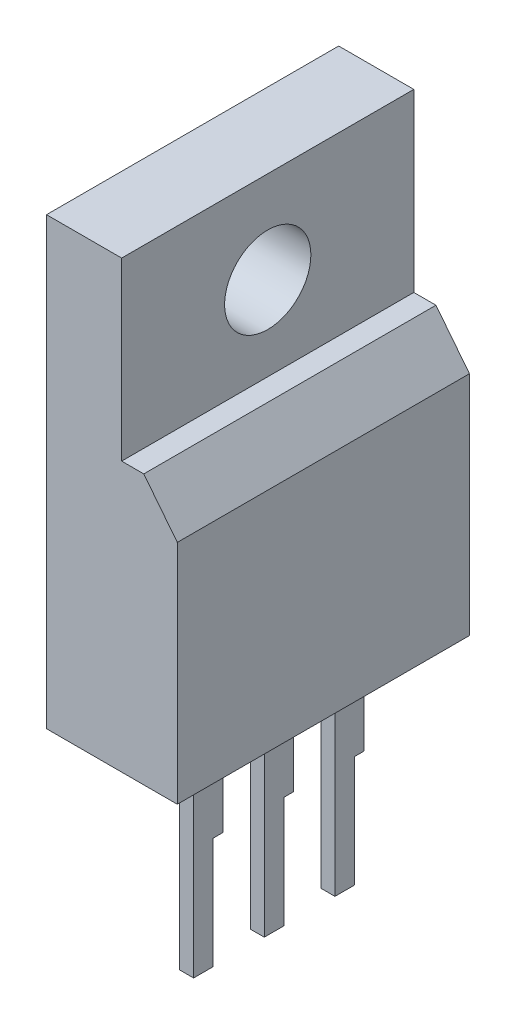
ISO-10303-21;
HEADER;
FILE_DESCRIPTION(('STEP AP214'),'2;1');
FILE_NAME('part.step','',(''),(''),'','','');
FILE_SCHEMA(('AUTOMOTIVE_DESIGN { 1 0 10303 214 1 1 1 1 }'));
ENDSEC;
DATA;
#1=APPLICATION_CONTEXT('core data for automotive mechanical design processes');
#2=APPLICATION_PROTOCOL_DEFINITION('international standard','automotive_design',2000,#1);
#3=PRODUCT_CONTEXT('',#1,'mechanical');
#4=PRODUCT('Part','Part','',(#3));
#5=PRODUCT_RELATED_PRODUCT_CATEGORY('part','',(#4));
#6=PRODUCT_DEFINITION_FORMATION('','',#4);
#7=PRODUCT_DEFINITION_CONTEXT('part definition',#1,'design');
#8=PRODUCT_DEFINITION('design','',#6,#7);
#9=PRODUCT_DEFINITION_SHAPE('','',#8);
#10=(LENGTH_UNIT() NAMED_UNIT(*) SI_UNIT(.MILLI.,.METRE.));
#11=(NAMED_UNIT(*) PLANE_ANGLE_UNIT() SI_UNIT($,.RADIAN.));
#12=(NAMED_UNIT(*) SI_UNIT($,.STERADIAN.) SOLID_ANGLE_UNIT());
#13=UNCERTAINTY_MEASURE_WITH_UNIT(LENGTH_MEASURE(1.E-05),#10,'distance_accuracy_value','');
#14=(GEOMETRIC_REPRESENTATION_CONTEXT(3) GLOBAL_UNCERTAINTY_ASSIGNED_CONTEXT((#13)) GLOBAL_UNIT_ASSIGNED_CONTEXT((#10,
#11,#12)) REPRESENTATION_CONTEXT('',''));
#15=CARTESIAN_POINT('',(0.,0.,0.));
#16=DIRECTION('',(0.,0.,1.));
#17=DIRECTION('',(1.,0.,0.));
#18=AXIS2_PLACEMENT_3D('',#15,#16,#17);
#19=CARTESIAN_POINT('',(3.1,0.,0.));
#20=DIRECTION('',(-1.,0.,0.));
#21=DIRECTION('',(0.,0.,1.));
#22=AXIS2_PLACEMENT_3D('',#19,#20,#21);
#23=PLANE('',#22);
#24=DIRECTION('',(0.,0.,-1.));
#25=VECTOR('',#24,1.);
#26=CARTESIAN_POINT('',(3.1,-23.3,2.53));
#27=LINE('',#26,#25);
#28=CARTESIAN_POINT('',(3.1,-23.3,2.53));
#29=VERTEX_POINT('',#28);
#30=CARTESIAN_POINT('',(3.1,-23.3,3.235));
#31=VERTEX_POINT('',#30);
#32=EDGE_CURVE('E249',#29,#31,#27,.F.);
#33=ORIENTED_EDGE('',*,*,#32,.F.);
#34=DIRECTION('',(0.,1.,0.));
#35=VECTOR('',#34,1.);
#36=CARTESIAN_POINT('',(3.1,-19.3,2.53));
#37=LINE('',#36,#35);
#38=CARTESIAN_POINT('',(3.1,-19.3,2.53));
#39=VERTEX_POINT('',#38);
#40=EDGE_CURVE('E254',#39,#29,#37,.F.);
#41=ORIENTED_EDGE('',*,*,#40,.F.);
#42=DIRECTION('',(0.,0.,-1.));
#43=VECTOR('',#42,1.);
#44=CARTESIAN_POINT('',(3.1,-19.3,2.185));
#45=LINE('',#44,#43);
#46=CARTESIAN_POINT('',(3.1,-19.3,2.185));
#47=VERTEX_POINT('',#46);
#48=EDGE_CURVE('E200',#47,#39,#45,.F.);
#49=ORIENTED_EDGE('',*,*,#48,.F.);
#50=DIRECTION('',(0.,1.,0.));
#51=VECTOR('',#50,1.);
#52=CARTESIAN_POINT('',(3.1,-16.,2.185));
#53=LINE('',#52,#51);
#54=CARTESIAN_POINT('',(3.1,-16.,2.185));
#55=VERTEX_POINT('',#54);
#56=EDGE_CURVE('E181',#55,#47,#53,.F.);
#57=ORIENTED_EDGE('',*,*,#56,.F.);
#58=DIRECTION('',(0.,0.,1.));
#59=VECTOR('',#58,1.);
#60=CARTESIAN_POINT('',(3.1,-16.,0.));
#61=LINE('',#60,#59);
#62=CARTESIAN_POINT('',(3.1,-16.,3.235));
#63=VERTEX_POINT('',#62);
#64=EDGE_CURVE('E186',#63,#55,#61,.F.);
#65=ORIENTED_EDGE('',*,*,#64,.F.);
#66=DIRECTION('',(0.,1.,0.));
#67=VECTOR('',#66,1.);
#68=CARTESIAN_POINT('',(3.1,-23.3,3.235));
#69=LINE('',#68,#67);
#70=EDGE_CURVE('E244',#31,#63,#69,.T.);
#71=ORIENTED_EDGE('',*,*,#70,.F.);
#72=EDGE_LOOP('',(#33,#41,#49,#57,#65,#71));
#73=FACE_BOUND('',#72,.T.);
#74=ADVANCED_FACE('F17',(#73),#23,.F.);
#75=CARTESIAN_POINT('',(3.1,0.,0.));
#76=DIRECTION('',(-1.,0.,0.));
#77=DIRECTION('',(0.,0.,1.));
#78=AXIS2_PLACEMENT_3D('',#75,#76,#77);
#79=PLANE('',#78);
#80=DIRECTION('',(0.,0.,-1.));
#81=VECTOR('',#80,1.);
#82=CARTESIAN_POINT('',(3.1,-23.3,5.07));
#83=LINE('',#82,#81);
#84=CARTESIAN_POINT('',(3.1,-23.3,5.07));
#85=VERTEX_POINT('',#84);
#86=CARTESIAN_POINT('',(3.1,-23.3,5.775));
#87=VERTEX_POINT('',#86);
#88=EDGE_CURVE('E317',#85,#87,#83,.F.);
#89=ORIENTED_EDGE('',*,*,#88,.F.);
#90=DIRECTION('',(0.,1.,0.));
#91=VECTOR('',#90,1.);
#92=CARTESIAN_POINT('',(3.1,-19.3,5.07));
#93=LINE('',#92,#91);
#94=CARTESIAN_POINT('',(3.1,-19.3,5.07));
#95=VERTEX_POINT('',#94);
#96=EDGE_CURVE('E322',#95,#85,#93,.F.);
#97=ORIENTED_EDGE('',*,*,#96,.F.);
#98=DIRECTION('',(0.,0.,-1.));
#99=VECTOR('',#98,1.);
#100=CARTESIAN_POINT('',(3.1,-19.3,4.725));
#101=LINE('',#100,#99);
#102=CARTESIAN_POINT('',(3.1,-19.3,4.725));
#103=VERTEX_POINT('',#102);
#104=EDGE_CURVE('E230',#103,#95,#101,.F.);
#105=ORIENTED_EDGE('',*,*,#104,.F.);
#106=DIRECTION('',(0.,1.,0.));
#107=VECTOR('',#106,1.);
#108=CARTESIAN_POINT('',(3.1,-16.,4.725));
#109=LINE('',#108,#107);
#110=CARTESIAN_POINT('',(3.1,-16.,4.725));
#111=VERTEX_POINT('',#110);
#112=EDGE_CURVE('E226',#111,#103,#109,.F.);
#113=ORIENTED_EDGE('',*,*,#112,.F.);
#114=DIRECTION('',(0.,0.,1.));
#115=VECTOR('',#114,1.);
#116=CARTESIAN_POINT('',(3.1,-16.,0.));
#117=LINE('',#116,#115);
#118=CARTESIAN_POINT('',(3.1,-16.,5.775));
#119=VERTEX_POINT('',#118);
#120=EDGE_CURVE('E196',#119,#111,#117,.F.);
#121=ORIENTED_EDGE('',*,*,#120,.F.);
#122=DIRECTION('',(0.,1.,0.));
#123=VECTOR('',#122,1.);
#124=CARTESIAN_POINT('',(3.1,-23.3,5.775));
#125=LINE('',#124,#123);
#126=EDGE_CURVE('E312',#87,#119,#125,.T.);
#127=ORIENTED_EDGE('',*,*,#126,.F.);
#128=EDGE_LOOP('',(#89,#97,#105,#113,#121,#127));
#129=FACE_BOUND('',#128,.T.);
#130=ADVANCED_FACE('F228',(#129),#79,.F.);
#131=CARTESIAN_POINT('',(3.1,0.,0.));
#132=DIRECTION('',(-1.,0.,0.));
#133=DIRECTION('',(0.,0.,1.));
#134=AXIS2_PLACEMENT_3D('',#131,#132,#133);
#135=PLANE('',#134);
#136=DIRECTION('',(0.,0.,-1.));
#137=VECTOR('',#136,1.);
#138=CARTESIAN_POINT('',(3.1,-23.3,7.61));
#139=LINE('',#138,#137);
#140=CARTESIAN_POINT('',(3.1,-23.3,7.61));
#141=VERTEX_POINT('',#140);
#142=CARTESIAN_POINT('',(3.1,-23.3,8.315));
#143=VERTEX_POINT('',#142);
#144=EDGE_CURVE('E291',#141,#143,#139,.F.);
#145=ORIENTED_EDGE('',*,*,#144,.F.);
#146=DIRECTION('',(0.,1.,0.));
#147=VECTOR('',#146,1.);
#148=CARTESIAN_POINT('',(3.1,-19.3,7.61));
#149=LINE('',#148,#147);
#150=CARTESIAN_POINT('',(3.1,-19.3,7.61));
#151=VERTEX_POINT('',#150);
#152=EDGE_CURVE('E296',#151,#141,#149,.F.);
#153=ORIENTED_EDGE('',*,*,#152,.F.);
#154=DIRECTION('',(0.,0.,-1.));
#155=VECTOR('',#154,1.);
#156=CARTESIAN_POINT('',(3.1,-19.3,7.265));
#157=LINE('',#156,#155);
#158=CARTESIAN_POINT('',(3.1,-19.3,7.265));
#159=VERTEX_POINT('',#158);
#160=EDGE_CURVE('E301',#159,#151,#157,.F.);
#161=ORIENTED_EDGE('',*,*,#160,.F.);
#162=DIRECTION('',(0.,1.,0.));
#163=VECTOR('',#162,1.);
#164=CARTESIAN_POINT('',(3.1,-16.,7.265));
#165=LINE('',#164,#163);
#166=CARTESIAN_POINT('',(3.1,-16.,7.265));
#167=VERTEX_POINT('',#166);
#168=EDGE_CURVE('E309',#167,#159,#165,.F.);
#169=ORIENTED_EDGE('',*,*,#168,.F.);
#170=DIRECTION('',(0.,0.,1.));
#171=VECTOR('',#170,1.);
#172=CARTESIAN_POINT('',(3.1,-16.,0.));
#173=LINE('',#172,#171);
#174=CARTESIAN_POINT('',(3.1,-16.,8.315));
#175=VERTEX_POINT('',#174);
#176=EDGE_CURVE('E202',#175,#167,#173,.F.);
#177=ORIENTED_EDGE('',*,*,#176,.F.);
#178=DIRECTION('',(0.,1.,0.));
#179=VECTOR('',#178,1.);
#180=CARTESIAN_POINT('',(3.1,-23.3,8.315));
#181=LINE('',#180,#179);
#182=EDGE_CURVE('E285',#143,#175,#181,.T.);
#183=ORIENTED_EDGE('',*,*,#182,.F.);
#184=EDGE_LOOP('',(#145,#153,#161,#169,#177,#183));
#185=FACE_BOUND('',#184,.T.);
#186=ADVANCED_FACE('F615',(#185),#135,.F.);
#187=CARTESIAN_POINT('',(2.6,-16.,2.185));
#188=DIRECTION('',(0.,0.,-1.));
#189=DIRECTION('',(-1.,0.,0.));
#190=AXIS2_PLACEMENT_3D('',#187,#188,#189);
#191=PLANE('',#190);
#192=DIRECTION('',(0.,1.,0.));
#193=VECTOR('',#192,1.);
#194=CARTESIAN_POINT('',(2.6,0.,2.185));
#195=LINE('',#194,#193);
#196=CARTESIAN_POINT('',(2.6,-16.,2.185));
#197=VERTEX_POINT('',#196);
#198=CARTESIAN_POINT('',(2.6,-19.3,2.185));
#199=VERTEX_POINT('',#198);
#200=EDGE_CURVE('E206',#197,#199,#195,.F.);
#201=ORIENTED_EDGE('',*,*,#200,.F.);
#202=DIRECTION('',(-1.,0.,0.));
#203=VECTOR('',#202,1.);
#204=CARTESIAN_POINT('',(2.6,-16.,2.185));
#205=LINE('',#204,#203);
#206=EDGE_CURVE('E190',#197,#55,#205,.F.);
#207=ORIENTED_EDGE('',*,*,#206,.T.);
#208=ORIENTED_EDGE('',*,*,#56,.T.);
#209=DIRECTION('',(1.,0.,0.));
#210=VECTOR('',#209,1.);
#211=CARTESIAN_POINT('',(2.6,-19.3,2.185));
#212=LINE('',#211,#210);
#213=EDGE_CURVE('E208',#199,#47,#212,.T.);
#214=ORIENTED_EDGE('',*,*,#213,.F.);
#215=EDGE_LOOP('',(#201,#207,#208,#214));
#216=FACE_BOUND('',#215,.T.);
#217=ADVANCED_FACE('F204',(#216),#191,.T.);
#218=CARTESIAN_POINT('',(2.6,-19.3,2.185));
#219=DIRECTION('',(0.,-1.,0.));
#220=DIRECTION('',(0.,0.,-1.));
#221=AXIS2_PLACEMENT_3D('',#218,#219,#220);
#222=PLANE('',#221);
#223=DIRECTION('',(-1.,0.,0.));
#224=VECTOR('',#223,1.);
#225=CARTESIAN_POINT('',(2.6,-19.3,2.53));
#226=LINE('',#225,#224);
#227=CARTESIAN_POINT('',(2.6,-19.3,2.53));
#228=VERTEX_POINT('',#227);
#229=EDGE_CURVE('E256',#228,#39,#226,.F.);
#230=ORIENTED_EDGE('',*,*,#229,.F.);
#231=DIRECTION('',(0.,0.,1.));
#232=VECTOR('',#231,1.);
#233=CARTESIAN_POINT('',(2.6,-19.3,0.));
#234=LINE('',#233,#232);
#235=EDGE_CURVE('E271',#199,#228,#234,.T.);
#236=ORIENTED_EDGE('',*,*,#235,.F.);
#237=ORIENTED_EDGE('',*,*,#213,.T.);
#238=ORIENTED_EDGE('',*,*,#48,.T.);
#239=EDGE_LOOP('',(#230,#236,#237,#238));
#240=FACE_BOUND('',#239,.T.);
#241=ADVANCED_FACE('F259',(#240),#222,.T.);
#242=CARTESIAN_POINT('',(2.6,-19.3,2.53));
#243=DIRECTION('',(0.,0.,-1.));
#244=DIRECTION('',(-1.,0.,0.));
#245=AXIS2_PLACEMENT_3D('',#242,#243,#244);
#246=PLANE('',#245);
#247=DIRECTION('',(1.,0.,0.));
#248=VECTOR('',#247,1.);
#249=CARTESIAN_POINT('',(2.6,-23.3,2.53));
#250=LINE('',#249,#248);
#251=CARTESIAN_POINT('',(2.6,-23.3,2.53));
#252=VERTEX_POINT('',#251);
#253=EDGE_CURVE('E251',#252,#29,#250,.T.);
#254=ORIENTED_EDGE('',*,*,#253,.F.);
#255=DIRECTION('',(0.,1.,0.));
#256=VECTOR('',#255,1.);
#257=CARTESIAN_POINT('',(2.6,0.,2.53));
#258=LINE('',#257,#256);
#259=EDGE_CURVE('E265',#228,#252,#258,.F.);
#260=ORIENTED_EDGE('',*,*,#259,.F.);
#261=ORIENTED_EDGE('',*,*,#229,.T.);
#262=ORIENTED_EDGE('',*,*,#40,.T.);
#263=EDGE_LOOP('',(#254,#260,#261,#262));
#264=FACE_BOUND('',#263,.T.);
#265=ADVANCED_FACE('F263',(#264),#246,.T.);
#266=CARTESIAN_POINT('',(2.6,-23.3,2.53));
#267=DIRECTION('',(0.,-1.,0.));
#268=DIRECTION('',(0.,0.,-1.));
#269=AXIS2_PLACEMENT_3D('',#266,#267,#268);
#270=PLANE('',#269);
#271=DIRECTION('',(1.,0.,0.));
#272=VECTOR('',#271,1.);
#273=CARTESIAN_POINT('',(2.6,-23.3,3.235));
#274=LINE('',#273,#272);
#275=CARTESIAN_POINT('',(2.6,-23.3,3.235));
#276=VERTEX_POINT('',#275);
#277=EDGE_CURVE('E246',#276,#31,#274,.T.);
#278=ORIENTED_EDGE('',*,*,#277,.F.);
#279=DIRECTION('',(0.,0.,1.));
#280=VECTOR('',#279,1.);
#281=CARTESIAN_POINT('',(2.6,-23.3,0.));
#282=LINE('',#281,#280);
#283=EDGE_CURVE('E270',#252,#276,#282,.T.);
#284=ORIENTED_EDGE('',*,*,#283,.F.);
#285=ORIENTED_EDGE('',*,*,#253,.T.);
#286=ORIENTED_EDGE('',*,*,#32,.T.);
#287=EDGE_LOOP('',(#278,#284,#285,#286));
#288=FACE_BOUND('',#287,.T.);
#289=ADVANCED_FACE('F350',(#288),#270,.T.);
#290=CARTESIAN_POINT('',(2.6,-23.3,3.235));
#291=DIRECTION('',(0.,0.,1.));
#292=DIRECTION('',(1.,0.,0.));
#293=AXIS2_PLACEMENT_3D('',#290,#291,#292);
#294=PLANE('',#293);
#295=DIRECTION('',(1.,0.,0.));
#296=VECTOR('',#295,1.);
#297=CARTESIAN_POINT('',(2.6,-16.,3.235));
#298=LINE('',#297,#296);
#299=CARTESIAN_POINT('',(2.6,-16.,3.235));
#300=VERTEX_POINT('',#299);
#301=EDGE_CURVE('E192',#63,#300,#298,.F.);
#302=ORIENTED_EDGE('',*,*,#301,.T.);
#303=DIRECTION('',(0.,1.,0.));
#304=VECTOR('',#303,1.);
#305=CARTESIAN_POINT('',(2.6,0.,3.235));
#306=LINE('',#305,#304);
#307=EDGE_CURVE('E344',#276,#300,#306,.T.);
#308=ORIENTED_EDGE('',*,*,#307,.F.);
#309=ORIENTED_EDGE('',*,*,#277,.T.);
#310=ORIENTED_EDGE('',*,*,#70,.T.);
#311=EDGE_LOOP('',(#302,#308,#309,#310));
#312=FACE_BOUND('',#311,.T.);
#313=ADVANCED_FACE('F352',(#312),#294,.T.);
#314=CARTESIAN_POINT('',(2.6,-16.,4.725));
#315=DIRECTION('',(0.,0.,-1.));
#316=DIRECTION('',(-1.,0.,0.));
#317=AXIS2_PLACEMENT_3D('',#314,#315,#316);
#318=PLANE('',#317);
#319=DIRECTION('',(0.,1.,0.));
#320=VECTOR('',#319,1.);
#321=CARTESIAN_POINT('',(2.6,0.,4.725));
#322=LINE('',#321,#320);
#323=CARTESIAN_POINT('',(2.6,-16.,4.725));
#324=VERTEX_POINT('',#323);
#325=CARTESIAN_POINT('',(2.6,-19.3,4.725));
#326=VERTEX_POINT('',#325);
#327=EDGE_CURVE('E236',#324,#326,#322,.F.);
#328=ORIENTED_EDGE('',*,*,#327,.F.);
#329=DIRECTION('',(-1.,0.,0.));
#330=VECTOR('',#329,1.);
#331=CARTESIAN_POINT('',(2.6,-16.,4.725));
#332=LINE('',#331,#330);
#333=EDGE_CURVE('E219',#324,#111,#332,.F.);
#334=ORIENTED_EDGE('',*,*,#333,.T.);
#335=ORIENTED_EDGE('',*,*,#112,.T.);
#336=DIRECTION('',(1.,0.,0.));
#337=VECTOR('',#336,1.);
#338=CARTESIAN_POINT('',(2.6,-19.3,4.725));
#339=LINE('',#338,#337);
#340=EDGE_CURVE('E238',#326,#103,#339,.T.);
#341=ORIENTED_EDGE('',*,*,#340,.F.);
#342=EDGE_LOOP('',(#328,#334,#335,#341));
#343=FACE_BOUND('',#342,.T.);
#344=ADVANCED_FACE('F234',(#343),#318,.T.);
#345=CARTESIAN_POINT('',(2.6,-19.3,4.725));
#346=DIRECTION('',(0.,-1.,0.));
#347=DIRECTION('',(0.,0.,-1.));
#348=AXIS2_PLACEMENT_3D('',#345,#346,#347);
#349=PLANE('',#348);
#350=DIRECTION('',(-1.,0.,0.));
#351=VECTOR('',#350,1.);
#352=CARTESIAN_POINT('',(2.6,-19.3,5.07));
#353=LINE('',#352,#351);
#354=CARTESIAN_POINT('',(2.6,-19.3,5.07));
#355=VERTEX_POINT('',#354);
#356=EDGE_CURVE('E324',#355,#95,#353,.F.);
#357=ORIENTED_EDGE('',*,*,#356,.F.);
#358=DIRECTION('',(0.,0.,1.));
#359=VECTOR('',#358,1.);
#360=CARTESIAN_POINT('',(2.6,-19.3,0.));
#361=LINE('',#360,#359);
#362=EDGE_CURVE('E339',#326,#355,#361,.T.);
#363=ORIENTED_EDGE('',*,*,#362,.F.);
#364=ORIENTED_EDGE('',*,*,#340,.T.);
#365=ORIENTED_EDGE('',*,*,#104,.T.);
#366=EDGE_LOOP('',(#357,#363,#364,#365));
#367=FACE_BOUND('',#366,.T.);
#368=ADVANCED_FACE('F327',(#367),#349,.T.);
#369=CARTESIAN_POINT('',(2.6,-19.3,5.07));
#370=DIRECTION('',(0.,0.,-1.));
#371=DIRECTION('',(-1.,0.,0.));
#372=AXIS2_PLACEMENT_3D('',#369,#370,#371);
#373=PLANE('',#372);
#374=DIRECTION('',(1.,0.,0.));
#375=VECTOR('',#374,1.);
#376=CARTESIAN_POINT('',(2.6,-23.3,5.07));
#377=LINE('',#376,#375);
#378=CARTESIAN_POINT('',(2.6,-23.3,5.07));
#379=VERTEX_POINT('',#378);
#380=EDGE_CURVE('E319',#379,#85,#377,.T.);
#381=ORIENTED_EDGE('',*,*,#380,.F.);
#382=DIRECTION('',(0.,1.,0.));
#383=VECTOR('',#382,1.);
#384=CARTESIAN_POINT('',(2.6,0.,5.07));
#385=LINE('',#384,#383);
#386=EDGE_CURVE('E333',#355,#379,#385,.F.);
#387=ORIENTED_EDGE('',*,*,#386,.F.);
#388=ORIENTED_EDGE('',*,*,#356,.T.);
#389=ORIENTED_EDGE('',*,*,#96,.T.);
#390=EDGE_LOOP('',(#381,#387,#388,#389));
#391=FACE_BOUND('',#390,.T.);
#392=ADVANCED_FACE('F331',(#391),#373,.T.);
#393=CARTESIAN_POINT('',(2.6,-23.3,5.07));
#394=DIRECTION('',(0.,-1.,0.));
#395=DIRECTION('',(0.,0.,-1.));
#396=AXIS2_PLACEMENT_3D('',#393,#394,#395);
#397=PLANE('',#396);
#398=DIRECTION('',(1.,0.,0.));
#399=VECTOR('',#398,1.);
#400=CARTESIAN_POINT('',(2.6,-23.3,5.775));
#401=LINE('',#400,#399);
#402=CARTESIAN_POINT('',(2.6,-23.3,5.775));
#403=VERTEX_POINT('',#402);
#404=EDGE_CURVE('E314',#403,#87,#401,.T.);
#405=ORIENTED_EDGE('',*,*,#404,.F.);
#406=DIRECTION('',(0.,0.,1.));
#407=VECTOR('',#406,1.);
#408=CARTESIAN_POINT('',(2.6,-23.3,0.));
#409=LINE('',#408,#407);
#410=EDGE_CURVE('E338',#379,#403,#409,.T.);
#411=ORIENTED_EDGE('',*,*,#410,.F.);
#412=ORIENTED_EDGE('',*,*,#380,.T.);
#413=ORIENTED_EDGE('',*,*,#88,.T.);
#414=EDGE_LOOP('',(#405,#411,#412,#413));
#415=FACE_BOUND('',#414,.T.);
#416=ADVANCED_FACE('F435',(#415),#397,.T.);
#417=CARTESIAN_POINT('',(2.6,-23.3,5.775));
#418=DIRECTION('',(0.,0.,1.));
#419=DIRECTION('',(1.,0.,0.));
#420=AXIS2_PLACEMENT_3D('',#417,#418,#419);
#421=PLANE('',#420);
#422=DIRECTION('',(1.,0.,0.));
#423=VECTOR('',#422,1.);
#424=CARTESIAN_POINT('',(2.6,-16.,5.775));
#425=LINE('',#424,#423);
#426=CARTESIAN_POINT('',(2.6,-16.,5.775));
#427=VERTEX_POINT('',#426);
#428=EDGE_CURVE('E221',#119,#427,#425,.F.);
#429=ORIENTED_EDGE('',*,*,#428,.T.);
#430=DIRECTION('',(0.,1.,0.));
#431=VECTOR('',#430,1.);
#432=CARTESIAN_POINT('',(2.6,0.,5.775));
#433=LINE('',#432,#431);
#434=EDGE_CURVE('E676',#403,#427,#433,.T.);
#435=ORIENTED_EDGE('',*,*,#434,.F.);
#436=ORIENTED_EDGE('',*,*,#404,.T.);
#437=ORIENTED_EDGE('',*,*,#126,.T.);
#438=EDGE_LOOP('',(#429,#435,#436,#437));
#439=FACE_BOUND('',#438,.T.);
#440=ADVANCED_FACE('F431',(#439),#421,.T.);
#441=CARTESIAN_POINT('',(2.6,-16.,7.265));
#442=DIRECTION('',(0.,0.,-1.));
#443=DIRECTION('',(-1.,0.,0.));
#444=AXIS2_PLACEMENT_3D('',#441,#442,#443);
#445=PLANE('',#444);
#446=DIRECTION('',(0.,1.,0.));
#447=VECTOR('',#446,1.);
#448=CARTESIAN_POINT('',(2.6,0.,7.265));
#449=LINE('',#448,#447);
#450=CARTESIAN_POINT('',(2.6,-16.,7.265));
#451=VERTEX_POINT('',#450);
#452=CARTESIAN_POINT('',(2.6,-19.3,7.265));
#453=VERTEX_POINT('',#452);
#454=EDGE_CURVE('E661',#451,#453,#449,.F.);
#455=ORIENTED_EDGE('',*,*,#454,.F.);
#456=DIRECTION('',(-1.,0.,0.));
#457=VECTOR('',#456,1.);
#458=CARTESIAN_POINT('',(2.6,-16.,7.265));
#459=LINE('',#458,#457);
#460=EDGE_CURVE('E306',#451,#167,#459,.F.);
#461=ORIENTED_EDGE('',*,*,#460,.T.);
#462=ORIENTED_EDGE('',*,*,#168,.T.);
#463=DIRECTION('',(1.,0.,0.));
#464=VECTOR('',#463,1.);
#465=CARTESIAN_POINT('',(2.6,-19.3,7.265));
#466=LINE('',#465,#464);
#467=EDGE_CURVE('E303',#453,#159,#466,.T.);
#468=ORIENTED_EDGE('',*,*,#467,.F.);
#469=EDGE_LOOP('',(#455,#461,#462,#468));
#470=FACE_BOUND('',#469,.T.);
#471=ADVANCED_FACE('F427',(#470),#445,.T.);
#472=CARTESIAN_POINT('',(2.6,-19.3,7.265));
#473=DIRECTION('',(0.,-1.,0.));
#474=DIRECTION('',(0.,0.,-1.));
#475=AXIS2_PLACEMENT_3D('',#472,#473,#474);
#476=PLANE('',#475);
#477=DIRECTION('',(-1.,0.,0.));
#478=VECTOR('',#477,1.);
#479=CARTESIAN_POINT('',(2.6,-19.3,7.61));
#480=LINE('',#479,#478);
#481=CARTESIAN_POINT('',(2.6,-19.3,7.61));
#482=VERTEX_POINT('',#481);
#483=EDGE_CURVE('E298',#482,#151,#480,.F.);
#484=ORIENTED_EDGE('',*,*,#483,.F.);
#485=DIRECTION('',(0.,0.,1.));
#486=VECTOR('',#485,1.);
#487=CARTESIAN_POINT('',(2.6,-19.3,0.));
#488=LINE('',#487,#486);
#489=EDGE_CURVE('E656',#453,#482,#488,.T.);
#490=ORIENTED_EDGE('',*,*,#489,.F.);
#491=ORIENTED_EDGE('',*,*,#467,.T.);
#492=ORIENTED_EDGE('',*,*,#160,.T.);
#493=EDGE_LOOP('',(#484,#490,#491,#492));
#494=FACE_BOUND('',#493,.T.);
#495=ADVANCED_FACE('F423',(#494),#476,.T.);
#496=CARTESIAN_POINT('',(2.6,-19.3,7.61));
#497=DIRECTION('',(0.,0.,-1.));
#498=DIRECTION('',(-1.,0.,0.));
#499=AXIS2_PLACEMENT_3D('',#496,#497,#498);
#500=PLANE('',#499);
#501=DIRECTION('',(1.,0.,0.));
#502=VECTOR('',#501,1.);
#503=CARTESIAN_POINT('',(2.6,-23.3,7.61));
#504=LINE('',#503,#502);
#505=CARTESIAN_POINT('',(2.6,-23.3,7.61));
#506=VERTEX_POINT('',#505);
#507=EDGE_CURVE('E293',#506,#141,#504,.T.);
#508=ORIENTED_EDGE('',*,*,#507,.F.);
#509=DIRECTION('',(0.,1.,0.));
#510=VECTOR('',#509,1.);
#511=CARTESIAN_POINT('',(2.6,0.,7.61));
#512=LINE('',#511,#510);
#513=EDGE_CURVE('E653',#482,#506,#512,.F.);
#514=ORIENTED_EDGE('',*,*,#513,.F.);
#515=ORIENTED_EDGE('',*,*,#483,.T.);
#516=ORIENTED_EDGE('',*,*,#152,.T.);
#517=EDGE_LOOP('',(#508,#514,#515,#516));
#518=FACE_BOUND('',#517,.T.);
#519=ADVANCED_FACE('F419',(#518),#500,.T.);
#520=CARTESIAN_POINT('',(2.6,-23.3,7.61));
#521=DIRECTION('',(0.,-1.,0.));
#522=DIRECTION('',(0.,0.,-1.));
#523=AXIS2_PLACEMENT_3D('',#520,#521,#522);
#524=PLANE('',#523);
#525=DIRECTION('',(1.,0.,0.));
#526=VECTOR('',#525,1.);
#527=CARTESIAN_POINT('',(2.6,-23.3,8.315));
#528=LINE('',#527,#526);
#529=CARTESIAN_POINT('',(2.6,-23.3,8.315));
#530=VERTEX_POINT('',#529);
#531=EDGE_CURVE('E288',#530,#143,#528,.T.);
#532=ORIENTED_EDGE('',*,*,#531,.F.);
#533=DIRECTION('',(0.,0.,1.));
#534=VECTOR('',#533,1.);
#535=CARTESIAN_POINT('',(2.6,-23.3,0.));
#536=LINE('',#535,#534);
#537=EDGE_CURVE('E650',#506,#530,#536,.T.);
#538=ORIENTED_EDGE('',*,*,#537,.F.);
#539=ORIENTED_EDGE('',*,*,#507,.T.);
#540=ORIENTED_EDGE('',*,*,#144,.T.);
#541=EDGE_LOOP('',(#532,#538,#539,#540));
#542=FACE_BOUND('',#541,.T.);
#543=ADVANCED_FACE('F415',(#542),#524,.T.);
#544=CARTESIAN_POINT('',(2.6,-23.3,8.315));
#545=DIRECTION('',(0.,0.,1.));
#546=DIRECTION('',(1.,0.,0.));
#547=AXIS2_PLACEMENT_3D('',#544,#545,#546);
#548=PLANE('',#547);
#549=DIRECTION('',(1.,0.,0.));
#550=VECTOR('',#549,1.);
#551=CARTESIAN_POINT('',(2.6,-16.,8.315));
#552=LINE('',#551,#550);
#553=CARTESIAN_POINT('',(2.6,-16.,8.315));
#554=VERTEX_POINT('',#553);
#555=EDGE_CURVE('E283',#175,#554,#552,.F.);
#556=ORIENTED_EDGE('',*,*,#555,.T.);
#557=DIRECTION('',(0.,1.,0.));
#558=VECTOR('',#557,1.);
#559=CARTESIAN_POINT('',(2.6,0.,8.315));
#560=LINE('',#559,#558);
#561=EDGE_CURVE('E667',#530,#554,#560,.T.);
#562=ORIENTED_EDGE('',*,*,#561,.F.);
#563=ORIENTED_EDGE('',*,*,#531,.T.);
#564=ORIENTED_EDGE('',*,*,#182,.T.);
#565=EDGE_LOOP('',(#556,#562,#563,#564));
#566=FACE_BOUND('',#565,.T.);
#567=ADVANCED_FACE('F411',(#566),#548,.T.);
#568=CARTESIAN_POINT('',(3.49510073942,-6.32,10.5));
#569=DIRECTION('',(0.,1.,0.));
#570=DIRECTION('',(0.,0.,1.));
#571=AXIS2_PLACEMENT_3D('',#568,#569,#570);
#572=PLANE('',#571);
#573=DIRECTION('',(1.,0.,0.));
#574=VECTOR('',#573,1.);
#575=CARTESIAN_POINT('',(3.49510073942,-6.32,0.));
#576=LINE('',#575,#574);
#577=CARTESIAN_POINT('',(3.49510073941989,-6.32000000000009,0.));
#578=VERTEX_POINT('',#577);
#579=CARTESIAN_POINT('',(2.7,-6.32,0.));
#580=VERTEX_POINT('',#579);
#581=EDGE_CURVE('E276',#578,#580,#576,.F.);
#582=ORIENTED_EDGE('',*,*,#581,.T.);
#583=DIRECTION('',(0.,0.,-1.));
#584=VECTOR('',#583,1.);
#585=CARTESIAN_POINT('',(2.7,-6.32,0.));
#586=LINE('',#585,#584);
#587=CARTESIAN_POINT('',(2.7,-6.32,10.5));
#588=VERTEX_POINT('',#587);
#589=EDGE_CURVE('E688',#588,#580,#586,.T.);
#590=ORIENTED_EDGE('',*,*,#589,.F.);
#591=DIRECTION('',(1.,0.,0.));
#592=VECTOR('',#591,1.);
#593=CARTESIAN_POINT('',(3.49510073942,-6.32,10.5));
#594=LINE('',#593,#592);
#595=CARTESIAN_POINT('',(3.49510073941989,-6.32000000000009,10.5));
#596=VERTEX_POINT('',#595);
#597=EDGE_CURVE('E281',#588,#596,#594,.T.);
#598=ORIENTED_EDGE('',*,*,#597,.T.);
#599=DIRECTION('',(0.,0.,1.));
#600=VECTOR('',#599,1.);
#601=CARTESIAN_POINT('',(3.49510073941955,-6.32000000000035,10.5));
#602=LINE('',#601,#600);
#603=EDGE_CURVE('E691',#578,#596,#602,.T.);
#604=ORIENTED_EDGE('',*,*,#603,.F.);
#605=EDGE_LOOP('',(#582,#590,#598,#604));
#606=FACE_BOUND('',#605,.T.);
#607=ADVANCED_FACE('F408',(#606),#572,.T.);
#608=CARTESIAN_POINT('',(2.6,0.,0.));
#609=DIRECTION('',(-1.,0.,0.));
#610=DIRECTION('',(0.,0.,1.));
#611=AXIS2_PLACEMENT_3D('',#608,#609,#610);
#612=PLANE('',#611);
#613=ORIENTED_EDGE('',*,*,#307,.T.);
#614=DIRECTION('',(0.,0.,-1.));
#615=VECTOR('',#614,1.);
#616=CARTESIAN_POINT('',(2.6,-16.,0.));
#617=LINE('',#616,#615);
#618=EDGE_CURVE('E679',#197,#300,#617,.F.);
#619=ORIENTED_EDGE('',*,*,#618,.F.);
#620=ORIENTED_EDGE('',*,*,#200,.T.);
#621=ORIENTED_EDGE('',*,*,#235,.T.);
#622=ORIENTED_EDGE('',*,*,#259,.T.);
#623=ORIENTED_EDGE('',*,*,#283,.T.);
#624=EDGE_LOOP('',(#613,#619,#620,#621,#622,#623));
#625=FACE_BOUND('',#624,.T.);
#626=ADVANCED_FACE('F274',(#625),#612,.T.);
#627=CARTESIAN_POINT('',(2.6,0.,0.));
#628=DIRECTION('',(-1.,0.,0.));
#629=DIRECTION('',(0.,0.,1.));
#630=AXIS2_PLACEMENT_3D('',#627,#628,#629);
#631=PLANE('',#630);
#632=ORIENTED_EDGE('',*,*,#434,.T.);
#633=DIRECTION('',(0.,0.,-1.));
#634=VECTOR('',#633,1.);
#635=CARTESIAN_POINT('',(2.6,-16.,0.));
#636=LINE('',#635,#634);
#637=EDGE_CURVE('E678',#324,#427,#636,.F.);
#638=ORIENTED_EDGE('',*,*,#637,.F.);
#639=ORIENTED_EDGE('',*,*,#327,.T.);
#640=ORIENTED_EDGE('',*,*,#362,.T.);
#641=ORIENTED_EDGE('',*,*,#386,.T.);
#642=ORIENTED_EDGE('',*,*,#410,.T.);
#643=EDGE_LOOP('',(#632,#638,#639,#640,#641,#642));
#644=FACE_BOUND('',#643,.T.);
#645=ADVANCED_FACE('F342',(#644),#631,.T.);
#646=CARTESIAN_POINT('',(2.6,0.,0.));
#647=DIRECTION('',(-1.,0.,0.));
#648=DIRECTION('',(0.,0.,1.));
#649=AXIS2_PLACEMENT_3D('',#646,#647,#648);
#650=PLANE('',#649);
#651=ORIENTED_EDGE('',*,*,#561,.T.);
#652=DIRECTION('',(0.,0.,-1.));
#653=VECTOR('',#652,1.);
#654=CARTESIAN_POINT('',(2.6,-16.,0.));
#655=LINE('',#654,#653);
#656=EDGE_CURVE('E664',#451,#554,#655,.F.);
#657=ORIENTED_EDGE('',*,*,#656,.F.);
#658=ORIENTED_EDGE('',*,*,#454,.T.);
#659=ORIENTED_EDGE('',*,*,#489,.T.);
#660=ORIENTED_EDGE('',*,*,#513,.T.);
#661=ORIENTED_EDGE('',*,*,#537,.T.);
#662=EDGE_LOOP('',(#651,#657,#658,#659,#660,#661));
#663=FACE_BOUND('',#662,.T.);
#664=ADVANCED_FACE('F399',(#663),#650,.T.);
#665=CARTESIAN_POINT('',(4.7,-16.,10.5));
#666=DIRECTION('',(1.,0.,0.));
#667=DIRECTION('',(0.,0.,-1.));
#668=AXIS2_PLACEMENT_3D('',#665,#666,#667);
#669=PLANE('',#668);
#670=DIRECTION('',(0.,0.,1.));
#671=VECTOR('',#670,1.);
#672=CARTESIAN_POINT('',(4.7,-7.849516031556,10.5));
#673=LINE('',#672,#671);
#674=CARTESIAN_POINT('',(4.7,-7.849516031556,10.5));
#675=VERTEX_POINT('',#674);
#676=CARTESIAN_POINT('',(4.7,-7.849516031556,0.));
#677=VERTEX_POINT('',#676);
#678=EDGE_CURVE('E668',#675,#677,#673,.F.);
#679=ORIENTED_EDGE('',*,*,#678,.F.);
#680=DIRECTION('',(0.,1.,0.));
#681=VECTOR('',#680,1.);
#682=CARTESIAN_POINT('',(4.7,0.,10.5));
#683=LINE('',#682,#681);
#684=CARTESIAN_POINT('',(4.7,-16.,10.5));
#685=VERTEX_POINT('',#684);
#686=EDGE_CURVE('E724',#685,#675,#683,.T.);
#687=ORIENTED_EDGE('',*,*,#686,.F.);
#688=DIRECTION('',(0.,0.,-1.));
#689=VECTOR('',#688,1.);
#690=CARTESIAN_POINT('',(4.7,-16.,0.));
#691=LINE('',#690,#689);
#692=CARTESIAN_POINT('',(4.7,-16.,0.));
#693=VERTEX_POINT('',#692);
#694=EDGE_CURVE('E683',#693,#685,#691,.F.);
#695=ORIENTED_EDGE('',*,*,#694,.F.);
#696=DIRECTION('',(0.,1.,0.));
#697=VECTOR('',#696,1.);
#698=CARTESIAN_POINT('',(4.7,0.,0.));
#699=LINE('',#698,#697);
#700=EDGE_CURVE('E704',#693,#677,#699,.T.);
#701=ORIENTED_EDGE('',*,*,#700,.T.);
#702=EDGE_LOOP('',(#679,#687,#695,#701));
#703=FACE_BOUND('',#702,.T.);
#704=ADVANCED_FACE('F395',(#703),#669,.T.);
#705=CARTESIAN_POINT('',(4.7,-7.849516031556,10.5));
#706=DIRECTION('',(0.785535105759401,0.618817095448701,0.));
#707=DIRECTION('',(-0.618817095448701,0.785535105759401,0.));
#708=AXIS2_PLACEMENT_3D('',#705,#706,#707);
#709=PLANE('',#708);
#710=ORIENTED_EDGE('',*,*,#603,.T.);
#711=DIRECTION('',(-0.61881709544847,0.785535105759583,0.));
#712=VECTOR('',#711,1.);
#713=CARTESIAN_POINT('',(4.7,-7.849516031556,10.5));
#714=LINE('',#713,#712);
#715=EDGE_CURVE('E699',#675,#596,#714,.T.);
#716=ORIENTED_EDGE('',*,*,#715,.F.);
#717=ORIENTED_EDGE('',*,*,#678,.T.);
#718=DIRECTION('',(-0.61881709544847,0.785535105759583,0.));
#719=VECTOR('',#718,1.);
#720=CARTESIAN_POINT('',(4.7,-7.849516031556,0.));
#721=LINE('',#720,#719);
#722=EDGE_CURVE('E697',#677,#578,#721,.T.);
#723=ORIENTED_EDGE('',*,*,#722,.T.);
#724=EDGE_LOOP('',(#710,#716,#717,#723));
#725=FACE_BOUND('',#724,.T.);
#726=ADVANCED_FACE('F391',(#725),#709,.T.);
#727=CARTESIAN_POINT('',(2.7,-16.,0.));
#728=DIRECTION('',(1.,0.,0.));
#729=DIRECTION('',(0.,0.,-1.));
#730=AXIS2_PLACEMENT_3D('',#727,#728,#729);
#731=PLANE('',#730);
#732=CARTESIAN_POINT('',(2.7,-3.3,5.25));
#733=DIRECTION('',(1.,0.,0.));
#734=DIRECTION('',(0.,0.,-1.));
#735=AXIS2_PLACEMENT_3D('',#732,#733,#734);
#736=CIRCLE('',#735,1.55);
#737=CARTESIAN_POINT('',(2.7,-3.3,3.7));
#738=VERTEX_POINT('',#737);
#739=EDGE_CURVE('E20',#738,#738,#736,.F.);
#740=ORIENTED_EDGE('',*,*,#739,.T.);
#741=EDGE_LOOP('',(#740));
#742=FACE_BOUND('',#741,.T.);
#743=DIRECTION('',(0.,1.,0.));
#744=VECTOR('',#743,1.);
#745=CARTESIAN_POINT('',(2.7,0.,10.5));
#746=LINE('',#745,#744);
#747=CARTESIAN_POINT('',(2.7,0.,10.5));
#748=VERTEX_POINT('',#747);
#749=EDGE_CURVE('E721',#588,#748,#746,.T.);
#750=ORIENTED_EDGE('',*,*,#749,.F.);
#751=ORIENTED_EDGE('',*,*,#589,.T.);
#752=DIRECTION('',(0.,1.,0.));
#753=VECTOR('',#752,1.);
#754=CARTESIAN_POINT('',(2.7,0.,0.));
#755=LINE('',#754,#753);
#756=CARTESIAN_POINT('',(2.7,0.,0.));
#757=VERTEX_POINT('',#756);
#758=EDGE_CURVE('E707',#580,#757,#755,.T.);
#759=ORIENTED_EDGE('',*,*,#758,.T.);
#760=DIRECTION('',(0.,0.,1.));
#761=VECTOR('',#760,1.);
#762=CARTESIAN_POINT('',(2.7,0.,0.));
#763=LINE('',#762,#761);
#764=EDGE_CURVE('E716',#748,#757,#763,.F.);
#765=ORIENTED_EDGE('',*,*,#764,.F.);
#766=EDGE_LOOP('',(#750,#751,#759,#765));
#767=FACE_BOUND('',#766,.T.);
#768=ADVANCED_FACE('F387',(#742,#767),#731,.T.);
#769=CARTESIAN_POINT('',(0.,-16.,0.));
#770=DIRECTION('',(0.,-1.,0.));
#771=DIRECTION('',(0.,0.,-1.));
#772=AXIS2_PLACEMENT_3D('',#769,#770,#771);
#773=PLANE('',#772);
#774=ORIENTED_EDGE('',*,*,#460,.F.);
#775=ORIENTED_EDGE('',*,*,#656,.T.);
#776=ORIENTED_EDGE('',*,*,#555,.F.);
#777=ORIENTED_EDGE('',*,*,#176,.T.);
#778=EDGE_LOOP('',(#774,#775,#776,#777));
#779=FACE_BOUND('',#778,.T.);
#780=ORIENTED_EDGE('',*,*,#333,.F.);
#781=ORIENTED_EDGE('',*,*,#637,.T.);
#782=ORIENTED_EDGE('',*,*,#428,.F.);
#783=ORIENTED_EDGE('',*,*,#120,.T.);
#784=EDGE_LOOP('',(#780,#781,#782,#783));
#785=FACE_BOUND('',#784,.T.);
#786=ORIENTED_EDGE('',*,*,#206,.F.);
#787=ORIENTED_EDGE('',*,*,#618,.T.);
#788=ORIENTED_EDGE('',*,*,#301,.F.);
#789=ORIENTED_EDGE('',*,*,#64,.T.);
#790=EDGE_LOOP('',(#786,#787,#788,#789));
#791=FACE_BOUND('',#790,.T.);
#792=ORIENTED_EDGE('',*,*,#694,.T.);
#793=DIRECTION('',(1.,0.,0.));
#794=VECTOR('',#793,1.);
#795=CARTESIAN_POINT('',(0.,-16.,10.5));
#796=LINE('',#795,#794);
#797=CARTESIAN_POINT('',(0.,-16.,10.5));
#798=VERTEX_POINT('',#797);
#799=EDGE_CURVE('E681',#798,#685,#796,.T.);
#800=ORIENTED_EDGE('',*,*,#799,.F.);
#801=DIRECTION('',(0.,0.,1.));
#802=VECTOR('',#801,1.);
#803=CARTESIAN_POINT('',(0.,-16.,0.));
#804=LINE('',#803,#802);
#805=CARTESIAN_POINT('',(0.,-16.,0.));
#806=VERTEX_POINT('',#805);
#807=EDGE_CURVE('E730',#806,#798,#804,.T.);
#808=ORIENTED_EDGE('',*,*,#807,.F.);
#809=DIRECTION('',(1.,0.,0.));
#810=VECTOR('',#809,1.);
#811=CARTESIAN_POINT('',(0.,-16.,0.));
#812=LINE('',#811,#810);
#813=EDGE_CURVE('E710',#806,#693,#812,.T.);
#814=ORIENTED_EDGE('',*,*,#813,.T.);
#815=EDGE_LOOP('',(#792,#800,#808,#814));
#816=FACE_BOUND('',#815,.T.);
#817=ADVANCED_FACE('F187',(#779,#785,#791,#816),#773,.T.);
#818=CARTESIAN_POINT('',(0.,0.,10.5));
#819=DIRECTION('',(0.,0.,1.));
#820=DIRECTION('',(1.,0.,0.));
#821=AXIS2_PLACEMENT_3D('',#818,#819,#820);
#822=PLANE('',#821);
#823=ORIENTED_EDGE('',*,*,#597,.F.);
#824=ORIENTED_EDGE('',*,*,#749,.T.);
#825=DIRECTION('',(1.,0.,0.));
#826=VECTOR('',#825,1.);
#827=CARTESIAN_POINT('',(2.7,0.,10.5));
#828=LINE('',#827,#826);
#829=CARTESIAN_POINT('',(0.,0.,10.5));
#830=VERTEX_POINT('',#829);
#831=EDGE_CURVE('E718',#830,#748,#828,.T.);
#832=ORIENTED_EDGE('',*,*,#831,.F.);
#833=DIRECTION('',(0.,1.,0.));
#834=VECTOR('',#833,1.);
#835=CARTESIAN_POINT('',(0.,0.,10.5));
#836=LINE('',#835,#834);
#837=EDGE_CURVE('E728',#798,#830,#836,.T.);
#838=ORIENTED_EDGE('',*,*,#837,.F.);
#839=ORIENTED_EDGE('',*,*,#799,.T.);
#840=ORIENTED_EDGE('',*,*,#686,.T.);
#841=ORIENTED_EDGE('',*,*,#715,.T.);
#842=EDGE_LOOP('',(#823,#824,#832,#838,#839,#840,#841));
#843=FACE_BOUND('',#842,.T.);
#844=ADVANCED_FACE('F381',(#843),#822,.T.);
#845=CARTESIAN_POINT('',(2.7,0.,0.));
#846=DIRECTION('',(0.,1.,0.));
#847=DIRECTION('',(0.,0.,1.));
#848=AXIS2_PLACEMENT_3D('',#845,#846,#847);
#849=PLANE('',#848);
#850=ORIENTED_EDGE('',*,*,#764,.T.);
#851=DIRECTION('',(1.,0.,0.));
#852=VECTOR('',#851,1.);
#853=CARTESIAN_POINT('',(0.,0.,0.));
#854=LINE('',#853,#852);
#855=CARTESIAN_POINT('',(0.,0.,0.));
#856=VERTEX_POINT('',#855);
#857=EDGE_CURVE('E34',#757,#856,#854,.F.);
#858=ORIENTED_EDGE('',*,*,#857,.T.);
#859=DIRECTION('',(0.,0.,1.));
#860=VECTOR('',#859,1.);
#861=CARTESIAN_POINT('',(0.,0.,0.));
#862=LINE('',#861,#860);
#863=EDGE_CURVE('E733',#830,#856,#862,.F.);
#864=ORIENTED_EDGE('',*,*,#863,.F.);
#865=ORIENTED_EDGE('',*,*,#831,.T.);
#866=EDGE_LOOP('',(#850,#858,#864,#865));
#867=FACE_BOUND('',#866,.T.);
#868=ADVANCED_FACE('F377',(#867),#849,.T.);
#869=CARTESIAN_POINT('',(0.,0.,0.));
#870=DIRECTION('',(0.,0.,1.));
#871=DIRECTION('',(1.,0.,0.));
#872=AXIS2_PLACEMENT_3D('',#869,#870,#871);
#873=PLANE('',#872);
#874=ORIENTED_EDGE('',*,*,#857,.F.);
#875=ORIENTED_EDGE('',*,*,#758,.F.);
#876=ORIENTED_EDGE('',*,*,#581,.F.);
#877=ORIENTED_EDGE('',*,*,#722,.F.);
#878=ORIENTED_EDGE('',*,*,#700,.F.);
#879=ORIENTED_EDGE('',*,*,#813,.F.);
#880=DIRECTION('',(0.,1.,0.));
#881=VECTOR('',#880,1.);
#882=CARTESIAN_POINT('',(0.,0.,0.));
#883=LINE('',#882,#881);
#884=EDGE_CURVE('E26',#856,#806,#883,.F.);
#885=ORIENTED_EDGE('',*,*,#884,.F.);
#886=EDGE_LOOP('',(#874,#875,#876,#877,#878,#879,#885));
#887=FACE_BOUND('',#886,.T.);
#888=ADVANCED_FACE('F370',(#887),#873,.F.);
#889=CARTESIAN_POINT('',(2.7,-3.3,5.25));
#890=DIRECTION('',(1.,0.,0.));
#891=DIRECTION('',(0.,0.,-1.));
#892=AXIS2_PLACEMENT_3D('',#889,#890,#891);
#893=CYLINDRICAL_SURFACE('',#892,1.55);
#894=ORIENTED_EDGE('',*,*,#739,.F.);
#895=EDGE_LOOP('',(#894));
#896=FACE_BOUND('',#895,.T.);
#897=CARTESIAN_POINT('',(0.,-3.3,5.25));
#898=DIRECTION('',(1.,0.,0.));
#899=DIRECTION('',(0.,0.,-1.));
#900=AXIS2_PLACEMENT_3D('',#897,#898,#899);
#901=CIRCLE('',#900,1.55);
#902=CARTESIAN_POINT('',(0.,-3.3,3.7));
#903=VERTEX_POINT('',#902);
#904=EDGE_CURVE('E11',#903,#903,#901,.T.);
#905=ORIENTED_EDGE('',*,*,#904,.F.);
#906=EDGE_LOOP('',(#905));
#907=FACE_BOUND('',#906,.T.);
#908=ADVANCED_FACE('F364',(#896,#907),#893,.F.);
#909=CARTESIAN_POINT('',(0.,0.,0.));
#910=DIRECTION('',(-1.,0.,0.));
#911=DIRECTION('',(0.,0.,1.));
#912=AXIS2_PLACEMENT_3D('',#909,#910,#911);
#913=PLANE('',#912);
#914=ORIENTED_EDGE('',*,*,#904,.T.);
#915=EDGE_LOOP('',(#914));
#916=FACE_BOUND('',#915,.T.);
#917=ORIENTED_EDGE('',*,*,#863,.T.);
#918=ORIENTED_EDGE('',*,*,#884,.T.);
#919=ORIENTED_EDGE('',*,*,#807,.T.);
#920=ORIENTED_EDGE('',*,*,#837,.T.);
#921=EDGE_LOOP('',(#917,#918,#919,#920));
#922=FACE_BOUND('',#921,.T.);
#923=ADVANCED_FACE('F362',(#916,#922),#913,.T.);
#924=CLOSED_SHELL('',(#74,#130,#186,#217,#241,#265,#289,#313,#344,#368,#392,#416,#440,#471,#495,
#519,#543,#567,#607,#626,#645,#664,#704,#726,#768,#817,#844,#868,#888,#908,#923));
#925=MANIFOLD_SOLID_BREP('B1',#924);
#926=ADVANCED_BREP_SHAPE_REPRESENTATION('',(#18,#925),#14);
#927=SHAPE_DEFINITION_REPRESENTATION(#9,#926);
ENDSEC;
END-ISO-10303-21;
